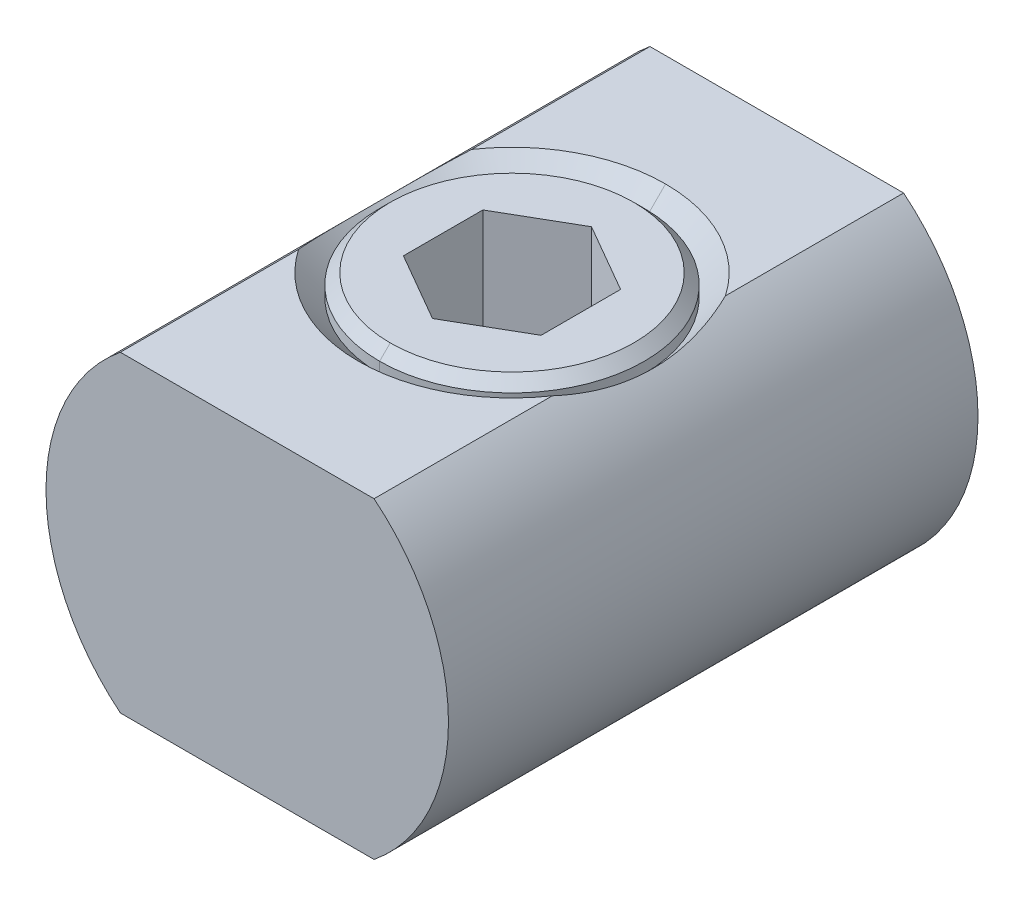
ISO-10303-21;
HEADER;
FILE_DESCRIPTION(('STEP AP214'),'2;1');
FILE_NAME('part.step','',(''),(''),'','','');
FILE_SCHEMA(('AUTOMOTIVE_DESIGN { 1 0 10303 214 1 1 1 1 }'));
ENDSEC;
DATA;
#1=APPLICATION_CONTEXT('core data for automotive mechanical design processes');
#2=APPLICATION_PROTOCOL_DEFINITION('international standard','automotive_design',2000,#1);
#3=PRODUCT_CONTEXT('',#1,'mechanical');
#4=PRODUCT('Part','Part','',(#3));
#5=PRODUCT_RELATED_PRODUCT_CATEGORY('part','',(#4));
#6=PRODUCT_DEFINITION_FORMATION('','',#4);
#7=PRODUCT_DEFINITION_CONTEXT('part definition',#1,'design');
#8=PRODUCT_DEFINITION('design','',#6,#7);
#9=PRODUCT_DEFINITION_SHAPE('','',#8);
#10=(LENGTH_UNIT() NAMED_UNIT(*) SI_UNIT(.MILLI.,.METRE.));
#11=(NAMED_UNIT(*) PLANE_ANGLE_UNIT() SI_UNIT($,.RADIAN.));
#12=(NAMED_UNIT(*) SI_UNIT($,.STERADIAN.) SOLID_ANGLE_UNIT());
#13=UNCERTAINTY_MEASURE_WITH_UNIT(LENGTH_MEASURE(1.E-05),#10,'distance_accuracy_value','');
#14=(GEOMETRIC_REPRESENTATION_CONTEXT(3) GLOBAL_UNCERTAINTY_ASSIGNED_CONTEXT((#13)) GLOBAL_UNIT_ASSIGNED_CONTEXT((#10,
#11,#12)) REPRESENTATION_CONTEXT('',''));
#15=CARTESIAN_POINT('',(0.,0.,0.));
#16=DIRECTION('',(0.,0.,1.));
#17=DIRECTION('',(1.,0.,0.));
#18=AXIS2_PLACEMENT_3D('',#15,#16,#17);
#19=CARTESIAN_POINT('',(1.1976539567003,2.95,2.5));
#20=DIRECTION('',(0.,-1.,0.));
#21=DIRECTION('',(0.,0.,-1.));
#22=AXIS2_PLACEMENT_3D('',#19,#20,#21);
#23=PLANE('',#22);
#24=DIRECTION('',(0.,0.,-1.));
#25=VECTOR('',#24,1.);
#26=CARTESIAN_POINT('',(1.1976539567003,2.95,2.5));
#27=LINE('',#26,#25);
#28=CARTESIAN_POINT('',(1.1976539567003,2.95,2.5));
#29=VERTEX_POINT('',#28);
#30=CARTESIAN_POINT('',(1.1976539567003,2.95,0.817389136213666));
#31=VERTEX_POINT('',#30);
#32=EDGE_CURVE('E10',#29,#31,#27,.T.);
#33=ORIENTED_EDGE('',*,*,#32,.T.);
#34=CARTESIAN_POINT('',(0.,2.95,0.));
#35=DIRECTION('',(0.,-1.,0.));
#36=DIRECTION('',(0.,0.,-1.));
#37=AXIS2_PLACEMENT_3D('',#34,#35,#36);
#38=CIRCLE('',#37,1.45);
#39=CARTESIAN_POINT('',(0.,2.95,1.45));
#40=VERTEX_POINT('',#39);
#41=EDGE_CURVE('E24',#31,#40,#38,.T.);
#42=ORIENTED_EDGE('',*,*,#41,.T.);
#43=CARTESIAN_POINT('',(0.,2.95,0.));
#44=DIRECTION('',(0.,-1.,0.));
#45=DIRECTION('',(0.,0.,-1.));
#46=AXIS2_PLACEMENT_3D('',#43,#44,#45);
#47=CIRCLE('',#46,1.45);
#48=CARTESIAN_POINT('',(-1.1976539567003,2.95,0.817389136213661));
#49=VERTEX_POINT('',#48);
#50=EDGE_CURVE('E400',#40,#49,#47,.T.);
#51=ORIENTED_EDGE('',*,*,#50,.T.);
#52=DIRECTION('',(0.,0.,-1.));
#53=VECTOR('',#52,1.);
#54=CARTESIAN_POINT('',(-1.1976539567003,2.95,2.5));
#55=LINE('',#54,#53);
#56=CARTESIAN_POINT('',(-1.1976539567003,2.95,2.5));
#57=VERTEX_POINT('',#56);
#58=EDGE_CURVE('E395',#57,#49,#55,.T.);
#59=ORIENTED_EDGE('',*,*,#58,.F.);
#60=DIRECTION('',(-1.,0.,0.));
#61=VECTOR('',#60,1.);
#62=CARTESIAN_POINT('',(1.1976539567003,2.95,2.5));
#63=LINE('',#62,#61);
#64=EDGE_CURVE('E390',#29,#57,#63,.T.);
#65=ORIENTED_EDGE('',*,*,#64,.F.);
#66=EDGE_LOOP('',(#33,#42,#51,#59,#65));
#67=FACE_BOUND('',#66,.T.);
#68=ADVANCED_FACE('F16',(#67),#23,.F.);
#69=CARTESIAN_POINT('',(0.,1.475,2.5));
#70=DIRECTION('',(0.,0.,1.));
#71=DIRECTION('',(1.,0.,0.));
#72=AXIS2_PLACEMENT_3D('',#69,#70,#71);
#73=PLANE('',#72);
#74=ORIENTED_EDGE('',*,*,#64,.T.);
#75=CARTESIAN_POINT('',(0.,1.475,2.5));
#76=DIRECTION('',(0.,0.,1.));
#77=DIRECTION('',(1.,0.,0.));
#78=AXIS2_PLACEMENT_3D('',#75,#76,#77);
#79=CIRCLE('',#78,1.89999999999992);
#80=CARTESIAN_POINT('',(-1.1976539567003,0.,2.5));
#81=VERTEX_POINT('',#80);
#82=EDGE_CURVE('E386',#57,#81,#79,.T.);
#83=ORIENTED_EDGE('',*,*,#82,.T.);
#84=DIRECTION('',(1.,0.,0.));
#85=VECTOR('',#84,1.);
#86=CARTESIAN_POINT('',(-1.1976539567003,0.,2.5));
#87=LINE('',#86,#85);
#88=CARTESIAN_POINT('',(1.1976539567003,0.,2.5));
#89=VERTEX_POINT('',#88);
#90=EDGE_CURVE('E382',#81,#89,#87,.T.);
#91=ORIENTED_EDGE('',*,*,#90,.T.);
#92=CARTESIAN_POINT('',(0.,1.475,2.5));
#93=DIRECTION('',(0.,0.,1.));
#94=DIRECTION('',(1.,0.,0.));
#95=AXIS2_PLACEMENT_3D('',#92,#93,#94);
#96=CIRCLE('',#95,1.89999999999992);
#97=EDGE_CURVE('E377',#89,#29,#96,.T.);
#98=ORIENTED_EDGE('',*,*,#97,.T.);
#99=EDGE_LOOP('',(#74,#83,#91,#98));
#100=FACE_BOUND('',#99,.T.);
#101=ADVANCED_FACE('F359',(#100),#73,.T.);
#102=CARTESIAN_POINT('',(0.,1.475,2.5));
#103=DIRECTION('',(0.,0.,-1.));
#104=DIRECTION('',(-1.,0.,0.));
#105=AXIS2_PLACEMENT_3D('',#102,#103,#104);
#106=CYLINDRICAL_SURFACE('',#105,1.89999999999992);
#107=DIRECTION('',(0.,0.,-1.));
#108=VECTOR('',#107,1.);
#109=CARTESIAN_POINT('',(1.1976539567003,2.95,2.5));
#110=LINE('',#109,#108);
#111=CARTESIAN_POINT('',(1.1976539567003,2.95,-0.817389136213663));
#112=VERTEX_POINT('',#111);
#113=CARTESIAN_POINT('',(1.1976539567003,2.95,-2.5));
#114=VERTEX_POINT('',#113);
#115=EDGE_CURVE('E374',#112,#114,#110,.T.);
#116=ORIENTED_EDGE('',*,*,#115,.F.);
#117=CARTESIAN_POINT('',(1.1976539567003,2.95,-0.817389136213663));
#118=CARTESIAN_POINT('',(1.20499943906959,2.94403534099518,-0.796044876758269));
#119=CARTESIAN_POINT('',(1.21203600378579,2.93823115801739,-0.774549421791335));
#120=CARTESIAN_POINT('',(1.22551400414405,2.92696179625069,-0.731225894182509));
#121=CARTESIAN_POINT('',(1.23195400022893,2.9214974474256,-0.709397157807463));
#122=CARTESIAN_POINT('',(1.24423674402112,2.91094585609487,-0.665442832619523));
#123=CARTESIAN_POINT('',(1.25007853287408,2.90585922249974,-0.643316829595897));
#124=CARTESIAN_POINT('',(1.26116203711495,2.89609989356745,-0.598803638407147));
#125=CARTESIAN_POINT('',(1.2664032399539,2.89142755255154,-0.576416244856477));
#126=CARTESIAN_POINT('',(1.27628251044216,2.8825322868818,-0.531416017461367));
#127=CARTESIAN_POINT('',(1.28092047794947,2.87830943686826,-0.508803146855024));
#128=CARTESIAN_POINT('',(1.28958943539994,2.87034716682095,-0.463387730011035));
#129=CARTESIAN_POINT('',(1.29362070250863,2.86660752614853,-0.440585275437997));
#130=CARTESIAN_POINT('',(1.30107166325794,2.85964381821113,-0.394826528792098));
#131=CARTESIAN_POINT('',(1.30449197468232,2.85641923049012,-0.37187041675068));
#132=CARTESIAN_POINT('',(1.31071440081976,2.85051667981492,-0.325840109490501));
#133=CARTESIAN_POINT('',(1.31351743612448,2.84783790330247,-0.302766143352974));
#134=CARTESIAN_POINT('',(1.31849999043289,2.84305324126788,-0.25653637130887));
#135=CARTESIAN_POINT('',(1.3206806855743,2.84094627547649,-0.23338080463088));
#136=CARTESIAN_POINT('',(1.32440384933669,2.83733666497288,-0.186984326875741));
#137=CARTESIAN_POINT('',(1.32594667924237,2.83583367818258,-0.163743471652671));
#138=CARTESIAN_POINT('',(1.32839172834965,2.83344703885945,-0.117138227337522));
#139=CARTESIAN_POINT('',(1.32929234058333,2.83256493999357,-0.0937736747145917));
#140=CARTESIAN_POINT('',(1.33047031586557,2.8314104857062,-0.0469650829009056));
#141=CARTESIAN_POINT('',(1.33074636824733,2.8311394125539,-0.0235209797630217));
#142=CARTESIAN_POINT('',(1.33068153274637,2.83120303039266,0.0234013232265716));
#143=CARTESIAN_POINT('',(1.33033969967211,2.83153864945279,0.0468795203277412));
#144=CARTESIAN_POINT('',(1.32904510073533,2.83280703290893,0.0938242723043996));
#145=CARTESIAN_POINT('',(1.32809177652428,2.83374034305146,0.117290796903706));
#146=CARTESIAN_POINT('',(1.32557720137082,2.8361936553676,0.164166503616944));
#147=CARTESIAN_POINT('',(1.3240157942358,2.83771380827718,0.187575669441811));
#148=CARTESIAN_POINT('',(1.32028598643622,2.84132779872265,0.234290904625191));
#149=CARTESIAN_POINT('',(1.31811784795126,2.84342138845783,0.257597014107294));
#150=CARTESIAN_POINT('',(1.31317316192843,2.84816713306461,0.304060302021387));
#151=CARTESIAN_POINT('',(1.31039731195929,2.85081864738139,0.327217620127971));
#152=CARTESIAN_POINT('',(1.30423441693467,2.85666225415219,0.373337605739608));
#153=CARTESIAN_POINT('',(1.30084852168582,2.85985332896384,0.396300555769181));
#154=CARTESIAN_POINT('',(1.29345862830043,2.86675798910105,0.441985444385646));
#155=CARTESIAN_POINT('',(1.28945625585147,2.87047019794749,0.46470785355515));
#156=CARTESIAN_POINT('',(1.28082640492113,2.87839511576093,0.509903692807999));
#157=CARTESIAN_POINT('',(1.2762000104608,2.88260695529726,0.532377483110255));
#158=CARTESIAN_POINT('',(1.26634472854236,2.89147984407849,0.577124289452941));
#159=CARTESIAN_POINT('',(1.2611153137751,2.89614128588512,0.599397111126053));
#160=CARTESIAN_POINT('',(1.25005034013955,2.90588379439506,0.643709278484985));
#161=CARTESIAN_POINT('',(1.24421453204224,2.91096503345875,0.665748524036787));
#162=CARTESIAN_POINT('',(1.23194141152339,2.92150816556906,0.70956162122163));
#163=CARTESIAN_POINT('',(1.22550422259579,2.9269699804059,0.731335526308885));
#164=CARTESIAN_POINT('',(1.21203023042744,2.93823597986533,0.774585306120806));
#165=CARTESIAN_POINT('',(1.2049939574776,2.94403986032944,0.796061425249171));
#166=CARTESIAN_POINT('',(1.1976539567003,2.95,0.817389136213666));
#167=B_SPLINE_CURVE_WITH_KNOTS('',3,(#117,#118,#119,#120,#121,#122,#123,#124,#125,#126,#127,
#128,#129,#130,#131,#132,#133,#134,#135,#136,#137,#138,#139,#140,#141,#142,#143,#144,#145,#146,
#147,#148,#149,#150,#151,#152,#153,#154,#155,#156,#157,#158,#159,#160,#161,#162,#163,#164,#165,
#166),.UNSPECIFIED.,.F.,.F.,(4,2,2,2,2,2,2,2,2,2,2,2,2,2,2,2,2,2,2,2,2,2,2,2,4),(0.,
0.0700397975524772,0.140244427706591,0.210559881720513,0.280934903964582,0.351321594168755,
0.421676030607222,0.491958918559781,0.562136267459856,0.632180098964355,0.702184203349887,
0.772362864319783,0.842688662283954,0.913122130062133,0.983620001903584,1.05413599383523,
1.12462156145894,1.19502664169131,1.26530038555222,1.33539188956132,1.40536316553744,
1.4753960984086,1.54545792968427,1.61550540520954,1.68549150893797),.UNSPECIFIED.);
#168=EDGE_CURVE('E303',#112,#31,#167,.T.);
#169=ORIENTED_EDGE('',*,*,#168,.T.);
#170=ORIENTED_EDGE('',*,*,#32,.F.);
#171=ORIENTED_EDGE('',*,*,#97,.F.);
#172=DIRECTION('',(0.,0.,-1.));
#173=VECTOR('',#172,1.);
#174=CARTESIAN_POINT('',(1.1976539567003,0.,2.5));
#175=LINE('',#174,#173);
#176=CARTESIAN_POINT('',(1.1976539567003,0.,-2.5));
#177=VERTEX_POINT('',#176);
#178=EDGE_CURVE('E662',#89,#177,#175,.T.);
#179=ORIENTED_EDGE('',*,*,#178,.T.);
#180=CARTESIAN_POINT('',(0.,1.475,-2.5));
#181=DIRECTION('',(0.,0.,1.));
#182=DIRECTION('',(1.,0.,0.));
#183=AXIS2_PLACEMENT_3D('',#180,#181,#182);
#184=CIRCLE('',#183,1.89999999999992);
#185=EDGE_CURVE('E421',#177,#114,#184,.T.);
#186=ORIENTED_EDGE('',*,*,#185,.T.);
#187=EDGE_LOOP('',(#116,#169,#170,#171,#179,#186));
#188=FACE_BOUND('',#187,.T.);
#189=ADVANCED_FACE('F355',(#188),#106,.T.);
#190=CARTESIAN_POINT('',(0.,1.475,-2.5));
#191=DIRECTION('',(0.,0.,1.));
#192=DIRECTION('',(1.,0.,0.));
#193=AXIS2_PLACEMENT_3D('',#190,#191,#192);
#194=PLANE('',#193);
#195=DIRECTION('',(-1.,0.,0.));
#196=VECTOR('',#195,1.);
#197=CARTESIAN_POINT('',(1.1976539567003,2.95,-2.5));
#198=LINE('',#197,#196);
#199=CARTESIAN_POINT('',(-1.1976539567003,2.95,-2.5));
#200=VERTEX_POINT('',#199);
#201=EDGE_CURVE('E663',#114,#200,#198,.T.);
#202=ORIENTED_EDGE('',*,*,#201,.F.);
#203=ORIENTED_EDGE('',*,*,#185,.F.);
#204=DIRECTION('',(1.,0.,0.));
#205=VECTOR('',#204,1.);
#206=CARTESIAN_POINT('',(-1.1976539567003,0.,-2.5));
#207=LINE('',#206,#205);
#208=CARTESIAN_POINT('',(-1.1976539567003,0.,-2.5));
#209=VERTEX_POINT('',#208);
#210=EDGE_CURVE('E661',#209,#177,#207,.T.);
#211=ORIENTED_EDGE('',*,*,#210,.F.);
#212=CARTESIAN_POINT('',(0.,1.475,-2.5));
#213=DIRECTION('',(0.,0.,1.));
#214=DIRECTION('',(1.,0.,0.));
#215=AXIS2_PLACEMENT_3D('',#212,#213,#214);
#216=CIRCLE('',#215,1.89999999999992);
#217=EDGE_CURVE('E413',#200,#209,#216,.T.);
#218=ORIENTED_EDGE('',*,*,#217,.F.);
#219=EDGE_LOOP('',(#202,#203,#211,#218));
#220=FACE_BOUND('',#219,.T.);
#221=ADVANCED_FACE('F351',(#220),#194,.F.);
#222=CARTESIAN_POINT('',(0.,1.475,2.5));
#223=DIRECTION('',(0.,0.,-1.));
#224=DIRECTION('',(1.,0.,0.));
#225=AXIS2_PLACEMENT_3D('',#222,#223,#224);
#226=CYLINDRICAL_SURFACE('',#225,1.89999999999992);
#227=ORIENTED_EDGE('',*,*,#58,.T.);
#228=CARTESIAN_POINT('',(-1.1976539567003,2.95,0.817389136213661));
#229=CARTESIAN_POINT('',(-1.20499943906959,2.94403534099518,0.796044876758266));
#230=CARTESIAN_POINT('',(-1.21203600378579,2.93823115801739,0.774549421791333));
#231=CARTESIAN_POINT('',(-1.22551400414405,2.9269617962507,0.731225894182507));
#232=CARTESIAN_POINT('',(-1.23195400022894,2.9214974474256,0.709397157807462));
#233=CARTESIAN_POINT('',(-1.24423674402112,2.91094585609487,0.665442832619522));
#234=CARTESIAN_POINT('',(-1.25007853287409,2.90585922249975,0.643316829595896));
#235=CARTESIAN_POINT('',(-1.26116203711495,2.89609989356746,0.598803638407146));
#236=CARTESIAN_POINT('',(-1.2664032399539,2.89142755255154,0.576416244856476));
#237=CARTESIAN_POINT('',(-1.27628251044217,2.88253228688181,0.531416017461366));
#238=CARTESIAN_POINT('',(-1.28092047794947,2.87830943686826,0.508803146855023));
#239=CARTESIAN_POINT('',(-1.28958943539995,2.87034716682095,0.463387730011034));
#240=CARTESIAN_POINT('',(-1.29362070250864,2.86660752614853,0.440585275437996));
#241=CARTESIAN_POINT('',(-1.30107166325794,2.85964381821113,0.394826528792098));
#242=CARTESIAN_POINT('',(-1.30449197468232,2.85641923049012,0.37187041675068));
#243=CARTESIAN_POINT('',(-1.31071440081976,2.85051667981493,0.3258401094905));
#244=CARTESIAN_POINT('',(-1.31351743612449,2.84783790330247,0.302766143352973));
#245=CARTESIAN_POINT('',(-1.31849999043289,2.84305324126789,0.25653637130887));
#246=CARTESIAN_POINT('',(-1.32068068557431,2.84094627547649,0.23338080463088));
#247=CARTESIAN_POINT('',(-1.3244038493367,2.83733666497289,0.186984326875741));
#248=CARTESIAN_POINT('',(-1.32594667924238,2.83583367818258,0.163743471652671));
#249=CARTESIAN_POINT('',(-1.32839172834965,2.83344703885945,0.117138227337522));
#250=CARTESIAN_POINT('',(-1.32929234058334,2.83256493999357,0.0937736747145921));
#251=CARTESIAN_POINT('',(-1.33047031586558,2.8314104857062,0.0469650829009063));
#252=CARTESIAN_POINT('',(-1.33074636824734,2.8311394125539,0.0235209797630228));
#253=CARTESIAN_POINT('',(-1.33068153274638,2.83120303039267,-0.0234013232265701));
#254=CARTESIAN_POINT('',(-1.33033969967211,2.8315386494528,-0.0468795203277396));
#255=CARTESIAN_POINT('',(-1.32904510073533,2.83280703290893,-0.0938242723043985));
#256=CARTESIAN_POINT('',(-1.32809177652428,2.83374034305147,-0.117290796903706));
#257=CARTESIAN_POINT('',(-1.32557720137083,2.8361936553676,-0.164166503616943));
#258=CARTESIAN_POINT('',(-1.3240157942358,2.83771380827718,-0.18757566944181));
#259=CARTESIAN_POINT('',(-1.32028598643623,2.84132779872265,-0.234290904625189));
#260=CARTESIAN_POINT('',(-1.31811784795126,2.84342138845784,-0.257597014107292));
#261=CARTESIAN_POINT('',(-1.31317316192843,2.84816713306461,-0.304060302021385));
#262=CARTESIAN_POINT('',(-1.31039731195929,2.85081864738139,-0.32721762012797));
#263=CARTESIAN_POINT('',(-1.30423441693467,2.85666225415219,-0.373337605739606));
#264=CARTESIAN_POINT('',(-1.30084852168582,2.85985332896384,-0.396300555769178));
#265=CARTESIAN_POINT('',(-1.29345862830044,2.86675798910105,-0.441985444385642));
#266=CARTESIAN_POINT('',(-1.28945625585148,2.87047019794749,-0.464707853555147));
#267=CARTESIAN_POINT('',(-1.28082640492113,2.87839511576093,-0.509903692807996));
#268=CARTESIAN_POINT('',(-1.27620001046081,2.88260695529726,-0.532377483110251));
#269=CARTESIAN_POINT('',(-1.26634472854237,2.89147984407849,-0.577124289452938));
#270=CARTESIAN_POINT('',(-1.26111531377511,2.89614128588512,-0.599397111126049));
#271=CARTESIAN_POINT('',(-1.25005034013955,2.90588379439506,-0.643709278484981));
#272=CARTESIAN_POINT('',(-1.24421453204225,2.91096503345875,-0.665748524036783));
#273=CARTESIAN_POINT('',(-1.23194141152339,2.92150816556906,-0.709561621221625));
#274=CARTESIAN_POINT('',(-1.22550422259579,2.9269699804059,-0.73133552630888));
#275=CARTESIAN_POINT('',(-1.21203023042744,2.93823597986533,-0.774585306120801));
#276=CARTESIAN_POINT('',(-1.20499395747761,2.94403986032944,-0.796061425249165));
#277=CARTESIAN_POINT('',(-1.1976539567003,2.95,-0.81738913621366));
#278=B_SPLINE_CURVE_WITH_KNOTS('',3,(#228,#229,#230,#231,#232,#233,#234,#235,#236,#237,#238,
#239,#240,#241,#242,#243,#244,#245,#246,#247,#248,#249,#250,#251,#252,#253,#254,#255,#256,#257,
#258,#259,#260,#261,#262,#263,#264,#265,#266,#267,#268,#269,#270,#271,#272,#273,#274,#275,#276,
#277),.UNSPECIFIED.,.F.,.F.,(4,2,2,2,2,2,2,2,2,2,2,2,2,2,2,2,2,2,2,2,2,2,2,2,4),(0.,
0.0700397975524778,0.14024442770659,0.210559881720511,0.280934903964581,0.351321594168754,
0.421676030607221,0.491958918559779,0.562136267459855,0.632180098964353,0.702184203349884,
0.772362864319781,0.84268866228395,0.913122130062129,0.983620001903582,1.05413599383523,
1.12462156145893,1.1950266416913,1.26530038555222,1.33539188956132,1.40536316553743,
1.4753960984086,1.54545792968426,1.61550540520953,1.68549150893796),.UNSPECIFIED.);
#279=CARTESIAN_POINT('',(-1.1976539567003,2.95,-0.817389136213661));
#280=VERTEX_POINT('',#279);
#281=EDGE_CURVE('E333',#49,#280,#278,.T.);
#282=ORIENTED_EDGE('',*,*,#281,.T.);
#283=DIRECTION('',(0.,0.,-1.));
#284=VECTOR('',#283,1.);
#285=CARTESIAN_POINT('',(-1.1976539567003,2.95,2.5));
#286=LINE('',#285,#284);
#287=EDGE_CURVE('E328',#280,#200,#286,.T.);
#288=ORIENTED_EDGE('',*,*,#287,.T.);
#289=ORIENTED_EDGE('',*,*,#217,.T.);
#290=DIRECTION('',(0.,0.,-1.));
#291=VECTOR('',#290,1.);
#292=CARTESIAN_POINT('',(-1.1976539567003,0.,2.5));
#293=LINE('',#292,#291);
#294=EDGE_CURVE('E323',#81,#209,#293,.T.);
#295=ORIENTED_EDGE('',*,*,#294,.F.);
#296=ORIENTED_EDGE('',*,*,#82,.F.);
#297=EDGE_LOOP('',(#227,#282,#288,#289,#295,#296));
#298=FACE_BOUND('',#297,.T.);
#299=ADVANCED_FACE('F341',(#298),#226,.T.);
#300=CARTESIAN_POINT('',(-1.1976539567003,0.,2.5));
#301=DIRECTION('',(0.,1.,0.));
#302=DIRECTION('',(0.,0.,1.));
#303=AXIS2_PLACEMENT_3D('',#300,#301,#302);
#304=PLANE('',#303);
#305=ORIENTED_EDGE('',*,*,#210,.T.);
#306=ORIENTED_EDGE('',*,*,#178,.F.);
#307=ORIENTED_EDGE('',*,*,#90,.F.);
#308=ORIENTED_EDGE('',*,*,#294,.T.);
#309=EDGE_LOOP('',(#305,#306,#307,#308));
#310=FACE_BOUND('',#309,.T.);
#311=ADVANCED_FACE('F350',(#310),#304,.F.);
#312=CARTESIAN_POINT('',(1.1976539567003,2.95,2.5));
#313=DIRECTION('',(0.,-1.,0.));
#314=DIRECTION('',(0.,0.,-1.));
#315=AXIS2_PLACEMENT_3D('',#312,#313,#314);
#316=PLANE('',#315);
#317=ORIENTED_EDGE('',*,*,#287,.F.);
#318=CARTESIAN_POINT('',(0.,2.95,0.));
#319=DIRECTION('',(0.,-1.,0.));
#320=DIRECTION('',(0.,0.,-1.));
#321=AXIS2_PLACEMENT_3D('',#318,#319,#320);
#322=CIRCLE('',#321,1.45);
#323=CARTESIAN_POINT('',(0.,2.95,-1.45));
#324=VERTEX_POINT('',#323);
#325=EDGE_CURVE('E319',#280,#324,#322,.T.);
#326=ORIENTED_EDGE('',*,*,#325,.T.);
#327=CARTESIAN_POINT('',(0.,2.95,0.));
#328=DIRECTION('',(0.,-1.,0.));
#329=DIRECTION('',(0.,0.,-1.));
#330=AXIS2_PLACEMENT_3D('',#327,#328,#329);
#331=CIRCLE('',#330,1.45);
#332=EDGE_CURVE('E314',#324,#112,#331,.T.);
#333=ORIENTED_EDGE('',*,*,#332,.T.);
#334=ORIENTED_EDGE('',*,*,#115,.T.);
#335=ORIENTED_EDGE('',*,*,#201,.T.);
#336=EDGE_LOOP('',(#317,#326,#333,#334,#335));
#337=FACE_BOUND('',#336,.T.);
#338=ADVANCED_FACE('F289',(#337),#316,.F.);
#339=CARTESIAN_POINT('',(0.,2.75,0.));
#340=DIRECTION('',(0.,1.,0.));
#341=DIRECTION('',(-1.,0.,0.));
#342=AXIS2_PLACEMENT_3D('',#339,#340,#341);
#343=CONICAL_SURFACE('',#342,1.25,0.785398163397447);
#344=DIRECTION('',(0.,0.707106781186549,-0.707106781186546));
#345=VECTOR('',#344,1.);
#346=CARTESIAN_POINT('',(0.,2.75,-1.25));
#347=LINE('',#346,#345);
#348=CARTESIAN_POINT('',(0.,2.75,-1.25));
#349=VERTEX_POINT('',#348);
#350=EDGE_CURVE('E309',#349,#324,#347,.T.);
#351=ORIENTED_EDGE('',*,*,#350,.F.);
#352=CARTESIAN_POINT('',(0.,2.75,0.));
#353=DIRECTION('',(0.,-1.,0.));
#354=DIRECTION('',(0.,0.,-1.));
#355=AXIS2_PLACEMENT_3D('',#352,#353,#354);
#356=CIRCLE('',#355,1.25);
#357=CARTESIAN_POINT('',(0.,2.75,1.25));
#358=VERTEX_POINT('',#357);
#359=EDGE_CURVE('E305',#349,#358,#356,.T.);
#360=ORIENTED_EDGE('',*,*,#359,.T.);
#361=DIRECTION('',(0.,0.707106781186549,0.707106781186546));
#362=VECTOR('',#361,1.);
#363=CARTESIAN_POINT('',(0.,2.75,1.25));
#364=LINE('',#363,#362);
#365=EDGE_CURVE('E263',#358,#40,#364,.T.);
#366=ORIENTED_EDGE('',*,*,#365,.T.);
#367=ORIENTED_EDGE('',*,*,#41,.F.);
#368=ORIENTED_EDGE('',*,*,#168,.F.);
#369=ORIENTED_EDGE('',*,*,#332,.F.);
#370=EDGE_LOOP('',(#351,#360,#366,#367,#368,#369));
#371=FACE_BOUND('',#370,.T.);
#372=ADVANCED_FACE('F283',(#371),#343,.F.);
#373=CARTESIAN_POINT('',(0.,2.75,0.));
#374=DIRECTION('',(0.,1.,0.));
#375=DIRECTION('',(1.,0.,0.));
#376=AXIS2_PLACEMENT_3D('',#373,#374,#375);
#377=CONICAL_SURFACE('',#376,1.25,0.785398163397447);
#378=ORIENTED_EDGE('',*,*,#350,.T.);
#379=ORIENTED_EDGE('',*,*,#325,.F.);
#380=ORIENTED_EDGE('',*,*,#281,.F.);
#381=ORIENTED_EDGE('',*,*,#50,.F.);
#382=ORIENTED_EDGE('',*,*,#365,.F.);
#383=CARTESIAN_POINT('',(0.,2.75,0.));
#384=DIRECTION('',(0.,-1.,0.));
#385=DIRECTION('',(0.,0.,-1.));
#386=AXIS2_PLACEMENT_3D('',#383,#384,#385);
#387=CIRCLE('',#386,1.25);
#388=EDGE_CURVE('E258',#358,#349,#387,.T.);
#389=ORIENTED_EDGE('',*,*,#388,.T.);
#390=EDGE_LOOP('',(#378,#379,#380,#381,#382,#389));
#391=FACE_BOUND('',#390,.T.);
#392=ADVANCED_FACE('F272',(#391),#377,.F.);
#393=CARTESIAN_POINT('',(0.,0.,0.));
#394=DIRECTION('',(0.,-1.,0.));
#395=DIRECTION('',(1.,0.,0.));
#396=AXIS2_PLACEMENT_3D('',#393,#394,#395);
#397=CYLINDRICAL_SURFACE('',#396,1.25);
#398=DIRECTION('',(0.,-1.,0.));
#399=VECTOR('',#398,1.);
#400=CARTESIAN_POINT('',(0.,2.85,1.25));
#401=LINE('',#400,#399);
#402=CARTESIAN_POINT('',(0.,2.85,1.25));
#403=VERTEX_POINT('',#402);
#404=EDGE_CURVE('E253',#403,#358,#401,.T.);
#405=ORIENTED_EDGE('',*,*,#404,.F.);
#406=CARTESIAN_POINT('',(0.,2.85,0.));
#407=DIRECTION('',(0.,-1.,0.));
#408=DIRECTION('',(0.,0.,-1.));
#409=AXIS2_PLACEMENT_3D('',#406,#407,#408);
#410=CIRCLE('',#409,1.25);
#411=CARTESIAN_POINT('',(0.,2.85,-1.25));
#412=VERTEX_POINT('',#411);
#413=EDGE_CURVE('E249',#403,#412,#410,.T.);
#414=ORIENTED_EDGE('',*,*,#413,.T.);
#415=DIRECTION('',(0.,-1.,0.));
#416=VECTOR('',#415,1.);
#417=CARTESIAN_POINT('',(0.,2.85,-1.25));
#418=LINE('',#417,#416);
#419=EDGE_CURVE('E244',#412,#349,#418,.T.);
#420=ORIENTED_EDGE('',*,*,#419,.T.);
#421=ORIENTED_EDGE('',*,*,#388,.F.);
#422=EDGE_LOOP('',(#405,#414,#420,#421));
#423=FACE_BOUND('',#422,.T.);
#424=ADVANCED_FACE('F282',(#423),#397,.T.);
#425=CARTESIAN_POINT('',(0.,0.,0.));
#426=DIRECTION('',(0.,-1.,0.));
#427=DIRECTION('',(-1.,0.,0.));
#428=AXIS2_PLACEMENT_3D('',#425,#426,#427);
#429=CYLINDRICAL_SURFACE('',#428,1.25);
#430=ORIENTED_EDGE('',*,*,#404,.T.);
#431=ORIENTED_EDGE('',*,*,#359,.F.);
#432=ORIENTED_EDGE('',*,*,#419,.F.);
#433=CARTESIAN_POINT('',(0.,2.85,0.));
#434=DIRECTION('',(0.,-1.,0.));
#435=DIRECTION('',(0.,0.,-1.));
#436=AXIS2_PLACEMENT_3D('',#433,#434,#435);
#437=CIRCLE('',#436,1.25);
#438=EDGE_CURVE('E239',#412,#403,#437,.T.);
#439=ORIENTED_EDGE('',*,*,#438,.T.);
#440=EDGE_LOOP('',(#430,#431,#432,#439));
#441=FACE_BOUND('',#440,.T.);
#442=ADVANCED_FACE('F430',(#441),#429,.T.);
#443=CARTESIAN_POINT('',(0.,2.95,0.));
#444=DIRECTION('',(0.,-1.,0.));
#445=DIRECTION('',(-1.,0.,0.));
#446=AXIS2_PLACEMENT_3D('',#443,#444,#445);
#447=CONICAL_SURFACE('',#446,1.15,0.785398163397448);
#448=DIRECTION('',(0.,-0.707106781186548,0.707106781186548));
#449=VECTOR('',#448,1.);
#450=CARTESIAN_POINT('',(0.,2.95,1.15));
#451=LINE('',#450,#449);
#452=CARTESIAN_POINT('',(0.,2.95,1.15));
#453=VERTEX_POINT('',#452);
#454=EDGE_CURVE('E234',#453,#403,#451,.T.);
#455=ORIENTED_EDGE('',*,*,#454,.T.);
#456=ORIENTED_EDGE('',*,*,#438,.F.);
#457=DIRECTION('',(0.,-0.707106781186548,-0.707106781186548));
#458=VECTOR('',#457,1.);
#459=CARTESIAN_POINT('',(0.,2.95,-1.15));
#460=LINE('',#459,#458);
#461=CARTESIAN_POINT('',(0.,2.95,-1.15));
#462=VERTEX_POINT('',#461);
#463=EDGE_CURVE('E229',#462,#412,#460,.T.);
#464=ORIENTED_EDGE('',*,*,#463,.F.);
#465=CARTESIAN_POINT('',(0.,2.95,0.));
#466=DIRECTION('',(0.,-1.,0.));
#467=DIRECTION('',(0.,0.,-1.));
#468=AXIS2_PLACEMENT_3D('',#465,#466,#467);
#469=CIRCLE('',#468,1.15);
#470=EDGE_CURVE('E225',#462,#453,#469,.T.);
#471=ORIENTED_EDGE('',*,*,#470,.T.);
#472=EDGE_LOOP('',(#455,#456,#464,#471));
#473=FACE_BOUND('',#472,.T.);
#474=ADVANCED_FACE('F439',(#473),#447,.T.);
#475=CARTESIAN_POINT('',(1.1976539567003,2.95,2.5));
#476=DIRECTION('',(0.,-1.,0.));
#477=DIRECTION('',(0.,0.,-1.));
#478=AXIS2_PLACEMENT_3D('',#475,#476,#477);
#479=PLANE('',#478);
#480=DIRECTION('',(0.866025403784443,0.,0.499999999999993));
#481=VECTOR('',#480,1.);
#482=CARTESIAN_POINT('',(-0.65,2.95,0.37527767497326));
#483=LINE('',#482,#481);
#484=CARTESIAN_POINT('',(-0.65,2.95,0.37527767497326));
#485=VERTEX_POINT('',#484);
#486=CARTESIAN_POINT('',(0.,2.95,0.75055534994651));
#487=VERTEX_POINT('',#486);
#488=EDGE_CURVE('E220',#485,#487,#483,.T.);
#489=ORIENTED_EDGE('',*,*,#488,.F.);
#490=DIRECTION('',(0.,0.,1.));
#491=VECTOR('',#490,1.);
#492=CARTESIAN_POINT('',(-0.65,2.95,-0.37527767497326));
#493=LINE('',#492,#491);
#494=CARTESIAN_POINT('',(-0.65,2.95,-0.37527767497326));
#495=VERTEX_POINT('',#494);
#496=EDGE_CURVE('E215',#495,#485,#493,.T.);
#497=ORIENTED_EDGE('',*,*,#496,.F.);
#498=DIRECTION('',(-0.866025403784443,0.,0.499999999999993));
#499=VECTOR('',#498,1.);
#500=CARTESIAN_POINT('',(0.,2.95,-0.75055534994651));
#501=LINE('',#500,#499);
#502=CARTESIAN_POINT('',(0.,2.95,-0.75055534994651));
#503=VERTEX_POINT('',#502);
#504=EDGE_CURVE('E210',#503,#495,#501,.T.);
#505=ORIENTED_EDGE('',*,*,#504,.F.);
#506=DIRECTION('',(-0.866025403784443,0.,-0.499999999999993));
#507=VECTOR('',#506,1.);
#508=CARTESIAN_POINT('',(0.65,2.95,-0.37527767497326));
#509=LINE('',#508,#507);
#510=CARTESIAN_POINT('',(0.65,2.95,-0.37527767497326));
#511=VERTEX_POINT('',#510);
#512=EDGE_CURVE('E206',#511,#503,#509,.T.);
#513=ORIENTED_EDGE('',*,*,#512,.F.);
#514=DIRECTION('',(0.,0.,-1.));
#515=VECTOR('',#514,1.);
#516=CARTESIAN_POINT('',(0.65,2.95,0.37527767497326));
#517=LINE('',#516,#515);
#518=CARTESIAN_POINT('',(0.65,2.95,0.37527767497326));
#519=VERTEX_POINT('',#518);
#520=EDGE_CURVE('E149',#519,#511,#517,.T.);
#521=ORIENTED_EDGE('',*,*,#520,.F.);
#522=DIRECTION('',(0.866025403784443,0.,-0.499999999999993));
#523=VECTOR('',#522,1.);
#524=CARTESIAN_POINT('',(0.,2.95,0.75055534994651));
#525=LINE('',#524,#523);
#526=EDGE_CURVE('E198',#487,#519,#525,.T.);
#527=ORIENTED_EDGE('',*,*,#526,.F.);
#528=EDGE_LOOP('',(#489,#497,#505,#513,#521,#527));
#529=FACE_BOUND('',#528,.T.);
#530=CARTESIAN_POINT('',(0.,2.95,0.));
#531=DIRECTION('',(0.,-1.,0.));
#532=DIRECTION('',(0.,0.,-1.));
#533=AXIS2_PLACEMENT_3D('',#530,#531,#532);
#534=CIRCLE('',#533,1.15);
#535=EDGE_CURVE('E193',#453,#462,#534,.T.);
#536=ORIENTED_EDGE('',*,*,#535,.F.);
#537=ORIENTED_EDGE('',*,*,#470,.F.);
#538=EDGE_LOOP('',(#536,#537));
#539=FACE_BOUND('',#538,.T.);
#540=ADVANCED_FACE('F441',(#529,#539),#479,.F.);
#541=CARTESIAN_POINT('',(0.,2.95,0.));
#542=DIRECTION('',(0.,-1.,0.));
#543=DIRECTION('',(1.,0.,0.));
#544=AXIS2_PLACEMENT_3D('',#541,#542,#543);
#545=CONICAL_SURFACE('',#544,1.15,0.785398163397448);
#546=ORIENTED_EDGE('',*,*,#454,.F.);
#547=ORIENTED_EDGE('',*,*,#535,.T.);
#548=ORIENTED_EDGE('',*,*,#463,.T.);
#549=ORIENTED_EDGE('',*,*,#413,.F.);
#550=EDGE_LOOP('',(#546,#547,#548,#549));
#551=FACE_BOUND('',#550,.T.);
#552=ADVANCED_FACE('F435',(#551),#545,.T.);
#553=CARTESIAN_POINT('',(0.,1.65,0.75055534994651));
#554=DIRECTION('',(0.499999999999993,0.,0.866025403784443));
#555=DIRECTION('',(0.866025403784443,0.,-0.499999999999993));
#556=AXIS2_PLACEMENT_3D('',#553,#554,#555);
#557=PLANE('',#556);
#558=ORIENTED_EDGE('',*,*,#526,.T.);
#559=DIRECTION('',(0.,1.,0.));
#560=VECTOR('',#559,1.);
#561=CARTESIAN_POINT('',(0.65,1.65,0.37527767497326));
#562=LINE('',#561,#560);
#563=CARTESIAN_POINT('',(0.65,1.65,0.37527767497326));
#564=VERTEX_POINT('',#563);
#565=EDGE_CURVE('E189',#564,#519,#562,.T.);
#566=ORIENTED_EDGE('',*,*,#565,.F.);
#567=DIRECTION('',(0.866025403784443,0.,-0.499999999999993));
#568=VECTOR('',#567,1.);
#569=CARTESIAN_POINT('',(0.,1.65,0.75055534994651));
#570=LINE('',#569,#568);
#571=CARTESIAN_POINT('',(0.,1.65,0.75055534994651));
#572=VERTEX_POINT('',#571);
#573=EDGE_CURVE('E144',#572,#564,#570,.T.);
#574=ORIENTED_EDGE('',*,*,#573,.F.);
#575=DIRECTION('',(0.,1.,0.));
#576=VECTOR('',#575,1.);
#577=CARTESIAN_POINT('',(0.,1.65,0.75055534994651));
#578=LINE('',#577,#576);
#579=EDGE_CURVE('E181',#572,#487,#578,.T.);
#580=ORIENTED_EDGE('',*,*,#579,.T.);
#581=EDGE_LOOP('',(#558,#566,#574,#580));
#582=FACE_BOUND('',#581,.T.);
#583=ADVANCED_FACE('F450',(#582),#557,.F.);
#584=CARTESIAN_POINT('',(-0.65,1.65,0.37527767497326));
#585=DIRECTION('',(-0.499999999999993,0.,0.866025403784443));
#586=DIRECTION('',(0.866025403784443,0.,0.499999999999993));
#587=AXIS2_PLACEMENT_3D('',#584,#585,#586);
#588=PLANE('',#587);
#589=ORIENTED_EDGE('',*,*,#488,.T.);
#590=ORIENTED_EDGE('',*,*,#579,.F.);
#591=DIRECTION('',(0.866025403784443,0.,0.499999999999993));
#592=VECTOR('',#591,1.);
#593=CARTESIAN_POINT('',(-0.65,1.65,0.37527767497326));
#594=LINE('',#593,#592);
#595=CARTESIAN_POINT('',(-0.65,1.65,0.37527767497326));
#596=VERTEX_POINT('',#595);
#597=EDGE_CURVE('E177',#596,#572,#594,.T.);
#598=ORIENTED_EDGE('',*,*,#597,.F.);
#599=DIRECTION('',(0.,1.,0.));
#600=VECTOR('',#599,1.);
#601=CARTESIAN_POINT('',(-0.65,1.65,0.37527767497326));
#602=LINE('',#601,#600);
#603=EDGE_CURVE('E172',#596,#485,#602,.T.);
#604=ORIENTED_EDGE('',*,*,#603,.T.);
#605=EDGE_LOOP('',(#589,#590,#598,#604));
#606=FACE_BOUND('',#605,.T.);
#607=ADVANCED_FACE('F532',(#606),#588,.F.);
#608=CARTESIAN_POINT('',(-0.65,1.65,-0.37527767497326));
#609=DIRECTION('',(-1.,0.,0.));
#610=DIRECTION('',(0.,0.,1.));
#611=AXIS2_PLACEMENT_3D('',#608,#609,#610);
#612=PLANE('',#611);
#613=ORIENTED_EDGE('',*,*,#496,.T.);
#614=ORIENTED_EDGE('',*,*,#603,.F.);
#615=DIRECTION('',(0.,0.,1.));
#616=VECTOR('',#615,1.);
#617=CARTESIAN_POINT('',(-0.65,1.65,-0.37527767497326));
#618=LINE('',#617,#616);
#619=CARTESIAN_POINT('',(-0.65,1.65,-0.37527767497326));
#620=VERTEX_POINT('',#619);
#621=EDGE_CURVE('E168',#620,#596,#618,.T.);
#622=ORIENTED_EDGE('',*,*,#621,.F.);
#623=DIRECTION('',(0.,1.,0.));
#624=VECTOR('',#623,1.);
#625=CARTESIAN_POINT('',(-0.65,1.65,-0.37527767497326));
#626=LINE('',#625,#624);
#627=EDGE_CURVE('E163',#620,#495,#626,.T.);
#628=ORIENTED_EDGE('',*,*,#627,.T.);
#629=EDGE_LOOP('',(#613,#614,#622,#628));
#630=FACE_BOUND('',#629,.T.);
#631=ADVANCED_FACE('F543',(#630),#612,.F.);
#632=CARTESIAN_POINT('',(0.,1.65,-0.75055534994651));
#633=DIRECTION('',(-0.499999999999993,0.,-0.866025403784443));
#634=DIRECTION('',(-0.866025403784443,0.,0.499999999999993));
#635=AXIS2_PLACEMENT_3D('',#632,#633,#634);
#636=PLANE('',#635);
#637=ORIENTED_EDGE('',*,*,#504,.T.);
#638=ORIENTED_EDGE('',*,*,#627,.F.);
#639=DIRECTION('',(-0.866025403784443,0.,0.499999999999993));
#640=VECTOR('',#639,1.);
#641=CARTESIAN_POINT('',(0.,1.65,-0.75055534994651));
#642=LINE('',#641,#640);
#643=CARTESIAN_POINT('',(0.,1.65,-0.75055534994651));
#644=VERTEX_POINT('',#643);
#645=EDGE_CURVE('E159',#644,#620,#642,.T.);
#646=ORIENTED_EDGE('',*,*,#645,.F.);
#647=DIRECTION('',(0.,1.,0.));
#648=VECTOR('',#647,1.);
#649=CARTESIAN_POINT('',(0.,1.65,-0.75055534994651));
#650=LINE('',#649,#648);
#651=EDGE_CURVE('E134',#644,#503,#650,.T.);
#652=ORIENTED_EDGE('',*,*,#651,.T.);
#653=EDGE_LOOP('',(#637,#638,#646,#652));
#654=FACE_BOUND('',#653,.T.);
#655=ADVANCED_FACE('F554',(#654),#636,.F.);
#656=CARTESIAN_POINT('',(0.65,1.65,-0.37527767497326));
#657=DIRECTION('',(0.499999999999993,0.,-0.866025403784443));
#658=DIRECTION('',(-0.866025403784443,0.,-0.499999999999993));
#659=AXIS2_PLACEMENT_3D('',#656,#657,#658);
#660=PLANE('',#659);
#661=ORIENTED_EDGE('',*,*,#512,.T.);
#662=ORIENTED_EDGE('',*,*,#651,.F.);
#663=DIRECTION('',(-0.866025403784443,0.,-0.499999999999993));
#664=VECTOR('',#663,1.);
#665=CARTESIAN_POINT('',(0.65,1.65,-0.37527767497326));
#666=LINE('',#665,#664);
#667=CARTESIAN_POINT('',(0.65,1.65,-0.37527767497326));
#668=VERTEX_POINT('',#667);
#669=EDGE_CURVE('E126',#668,#644,#666,.T.);
#670=ORIENTED_EDGE('',*,*,#669,.F.);
#671=DIRECTION('',(0.,1.,0.));
#672=VECTOR('',#671,1.);
#673=CARTESIAN_POINT('',(0.65,1.65,-0.37527767497326));
#674=LINE('',#673,#672);
#675=EDGE_CURVE('E131',#668,#511,#674,.T.);
#676=ORIENTED_EDGE('',*,*,#675,.T.);
#677=EDGE_LOOP('',(#661,#662,#670,#676));
#678=FACE_BOUND('',#677,.T.);
#679=ADVANCED_FACE('F129',(#678),#660,.F.);
#680=CARTESIAN_POINT('',(0.65,1.65,0.37527767497326));
#681=DIRECTION('',(1.,0.,0.));
#682=DIRECTION('',(0.,0.,-1.));
#683=AXIS2_PLACEMENT_3D('',#680,#681,#682);
#684=PLANE('',#683);
#685=ORIENTED_EDGE('',*,*,#520,.T.);
#686=ORIENTED_EDGE('',*,*,#675,.F.);
#687=DIRECTION('',(0.,0.,-1.));
#688=VECTOR('',#687,1.);
#689=CARTESIAN_POINT('',(0.65,1.65,0.37527767497326));
#690=LINE('',#689,#688);
#691=EDGE_CURVE('E140',#564,#668,#690,.T.);
#692=ORIENTED_EDGE('',*,*,#691,.F.);
#693=ORIENTED_EDGE('',*,*,#565,.T.);
#694=EDGE_LOOP('',(#685,#686,#692,#693));
#695=FACE_BOUND('',#694,.T.);
#696=ADVANCED_FACE('F148',(#695),#684,.F.);
#697=CARTESIAN_POINT('',(0.,1.65,0.));
#698=DIRECTION('',(0.,1.,0.));
#699=DIRECTION('',(0.,0.,1.));
#700=AXIS2_PLACEMENT_3D('',#697,#698,#699);
#701=PLANE('',#700);
#702=ORIENTED_EDGE('',*,*,#621,.T.);
#703=ORIENTED_EDGE('',*,*,#597,.T.);
#704=ORIENTED_EDGE('',*,*,#573,.T.);
#705=ORIENTED_EDGE('',*,*,#691,.T.);
#706=ORIENTED_EDGE('',*,*,#669,.T.);
#707=ORIENTED_EDGE('',*,*,#645,.T.);
#708=EDGE_LOOP('',(#702,#703,#704,#705,#706,#707));
#709=FACE_BOUND('',#708,.T.);
#710=ADVANCED_FACE('F142',(#709),#701,.T.);
#711=CLOSED_SHELL('',(#68,#101,#189,#221,#299,#311,#338,#372,#392,#424,#442,#474,#540,#552,#583,
#607,#631,#655,#679,#696,#710));
#712=MANIFOLD_SOLID_BREP('B1',#711);
#713=ADVANCED_BREP_SHAPE_REPRESENTATION('',(#18,#712),#14);
#714=SHAPE_DEFINITION_REPRESENTATION(#9,#713);
ENDSEC;
END-ISO-10303-21;
